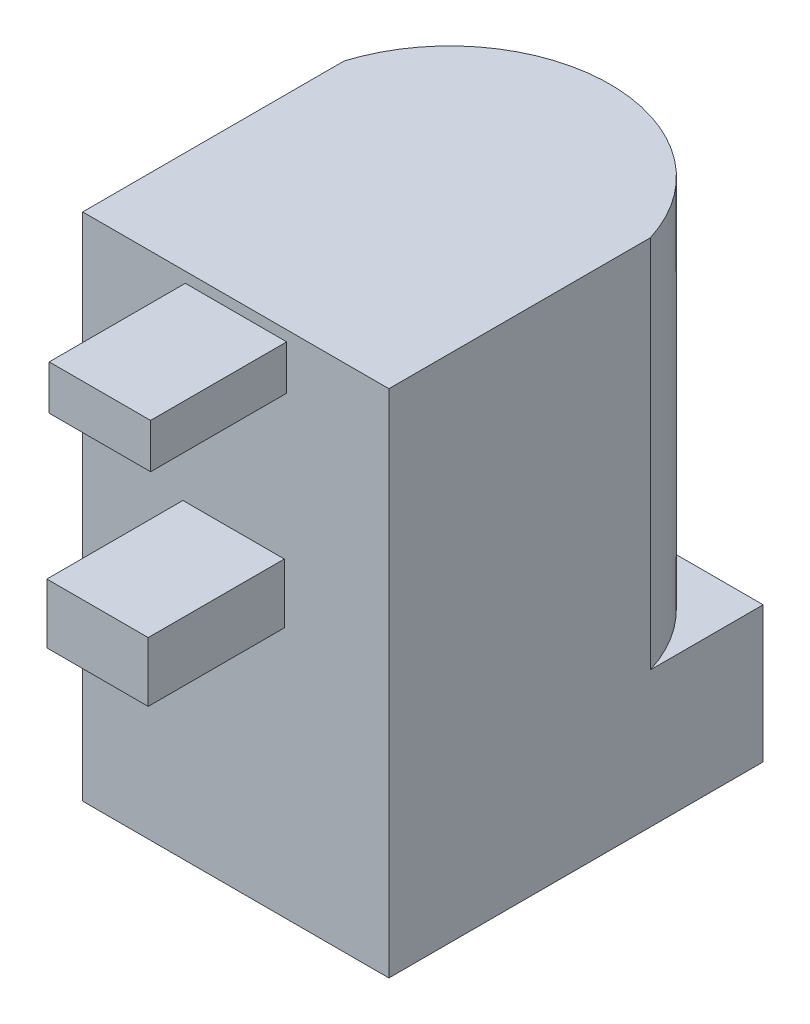
ISO-10303-21;
HEADER;
FILE_DESCRIPTION(('STEP AP214'),'2;1');
FILE_NAME('part.step','',(''),(''),'','','');
FILE_SCHEMA(('AUTOMOTIVE_DESIGN { 1 0 10303 214 1 1 1 1 }'));
ENDSEC;
DATA;
#1=APPLICATION_CONTEXT('core data for automotive mechanical design processes');
#2=APPLICATION_PROTOCOL_DEFINITION('international standard','automotive_design',2000,#1);
#3=PRODUCT_CONTEXT('',#1,'mechanical');
#4=PRODUCT('Part','Part','',(#3));
#5=PRODUCT_RELATED_PRODUCT_CATEGORY('part','',(#4));
#6=PRODUCT_DEFINITION_FORMATION('','',#4);
#7=PRODUCT_DEFINITION_CONTEXT('part definition',#1,'design');
#8=PRODUCT_DEFINITION('design','',#6,#7);
#9=PRODUCT_DEFINITION_SHAPE('','',#8);
#10=(LENGTH_UNIT() NAMED_UNIT(*) SI_UNIT(.MILLI.,.METRE.));
#11=(NAMED_UNIT(*) PLANE_ANGLE_UNIT() SI_UNIT($,.RADIAN.));
#12=(NAMED_UNIT(*) SI_UNIT($,.STERADIAN.) SOLID_ANGLE_UNIT());
#13=UNCERTAINTY_MEASURE_WITH_UNIT(LENGTH_MEASURE(1.E-05),#10,'distance_accuracy_value','');
#14=(GEOMETRIC_REPRESENTATION_CONTEXT(3) GLOBAL_UNCERTAINTY_ASSIGNED_CONTEXT((#13)) GLOBAL_UNIT_ASSIGNED_CONTEXT((#10,
#11,#12)) REPRESENTATION_CONTEXT('',''));
#15=CARTESIAN_POINT('',(0.,0.,0.));
#16=DIRECTION('',(0.,0.,1.));
#17=DIRECTION('',(1.,0.,0.));
#18=AXIS2_PLACEMENT_3D('',#15,#16,#17);
#19=CARTESIAN_POINT('',(-3.84818941504178,15.,5.33426183844011));
#20=DIRECTION('',(0.,0.,-1.));
#21=DIRECTION('',(-1.,0.,0.));
#22=AXIS2_PLACEMENT_3D('',#19,#20,#21);
#23=PLANE('',#22);
#24=DIRECTION('',(0.,-1.,0.));
#25=VECTOR('',#24,1.);
#26=CARTESIAN_POINT('',(-0.832403017018213,13.3838371317521,5.33426183844011));
#27=LINE('',#26,#25);
#28=CARTESIAN_POINT('',(-0.832403017018213,14.6905222156593,5.33426183844011));
#29=VERTEX_POINT('',#28);
#30=CARTESIAN_POINT('',(-0.832403017018213,13.3838371317521,5.33426183844011));
#31=VERTEX_POINT('',#30);
#32=EDGE_CURVE('E159',#29,#31,#27,.T.);
#33=ORIENTED_EDGE('',*,*,#32,.F.);
#34=DIRECTION('',(-1.,0.,0.));
#35=VECTOR('',#34,1.);
#36=CARTESIAN_POINT('',(-0.832403017018213,14.6905222156593,5.33426183844011));
#37=LINE('',#36,#35);
#38=CARTESIAN_POINT('',(2.14747638164835,14.6905222156593,5.33426183844011));
#39=VERTEX_POINT('',#38);
#40=EDGE_CURVE('E172',#39,#29,#37,.T.);
#41=ORIENTED_EDGE('',*,*,#40,.F.);
#42=DIRECTION('',(0.,1.,0.));
#43=VECTOR('',#42,1.);
#44=CARTESIAN_POINT('',(2.14747638164835,13.3838371317521,5.33426183844011));
#45=LINE('',#44,#43);
#46=CARTESIAN_POINT('',(2.14747638164835,13.3838371317521,5.33426183844011));
#47=VERTEX_POINT('',#46);
#48=EDGE_CURVE('E181',#47,#39,#45,.T.);
#49=ORIENTED_EDGE('',*,*,#48,.F.);
#50=DIRECTION('',(1.,0.,0.));
#51=VECTOR('',#50,1.);
#52=CARTESIAN_POINT('',(-0.832403017018213,13.3838371317521,5.33426183844011));
#53=LINE('',#52,#51);
#54=EDGE_CURVE('E162',#31,#47,#53,.T.);
#55=ORIENTED_EDGE('',*,*,#54,.F.);
#56=EDGE_LOOP('',(#33,#41,#49,#55));
#57=FACE_BOUND('',#56,.T.);
#58=DIRECTION('',(1.,0.,0.));
#59=VECTOR('',#58,1.);
#60=CARTESIAN_POINT('',(-3.84818941504178,0.,5.33426183844011));
#61=LINE('',#60,#59);
#62=CARTESIAN_POINT('',(-3.84818941504178,0.,5.33426183844011));
#63=VERTEX_POINT('',#62);
#64=CARTESIAN_POINT('',(5.15181058495822,0.,5.33426183844011));
#65=VERTEX_POINT('',#64);
#66=EDGE_CURVE('E231',#63,#65,#61,.T.);
#67=ORIENTED_EDGE('',*,*,#66,.T.);
#68=DIRECTION('',(0.,-1.,0.));
#69=VECTOR('',#68,1.);
#70=CARTESIAN_POINT('',(5.15181058495822,15.,5.33426183844011));
#71=LINE('',#70,#69);
#72=CARTESIAN_POINT('',(5.15181058495822,15.,5.33426183844011));
#73=VERTEX_POINT('',#72);
#74=EDGE_CURVE('E241',#73,#65,#71,.T.);
#75=ORIENTED_EDGE('',*,*,#74,.F.);
#76=DIRECTION('',(1.,0.,0.));
#77=VECTOR('',#76,1.);
#78=CARTESIAN_POINT('',(-3.84818941504178,15.,5.33426183844011));
#79=LINE('',#78,#77);
#80=CARTESIAN_POINT('',(-3.84818941504178,15.,5.33426183844011));
#81=VERTEX_POINT('',#80);
#82=EDGE_CURVE('E222',#81,#73,#79,.T.);
#83=ORIENTED_EDGE('',*,*,#82,.F.);
#84=DIRECTION('',(0.,-1.,0.));
#85=VECTOR('',#84,1.);
#86=CARTESIAN_POINT('',(-3.84818941504178,15.,5.33426183844011));
#87=LINE('',#86,#85);
#88=EDGE_CURVE('E244',#81,#63,#87,.T.);
#89=ORIENTED_EDGE('',*,*,#88,.T.);
#90=EDGE_LOOP('',(#67,#75,#83,#89));
#91=FACE_BOUND('',#90,.T.);
#92=DIRECTION('',(0.,-1.,0.));
#93=VECTOR('',#92,1.);
#94=CARTESIAN_POINT('',(-0.901871002237108,9.12840277679505,5.33426183844011));
#95=LINE('',#94,#93);
#96=CARTESIAN_POINT('',(-0.901871002237108,9.12840277679505,5.33426183844011));
#97=VERTEX_POINT('',#96);
#98=CARTESIAN_POINT('',(-0.901871002237108,7.37553254228531,5.33426183844011));
#99=VERTEX_POINT('',#98);
#100=EDGE_CURVE('E158',#97,#99,#95,.T.);
#101=ORIENTED_EDGE('',*,*,#100,.F.);
#102=DIRECTION('',(-1.,0.,0.));
#103=VECTOR('',#102,1.);
#104=CARTESIAN_POINT('',(-0.901871002237108,9.12840277679505,5.33426183844011));
#105=LINE('',#104,#103);
#106=CARTESIAN_POINT('',(2.07800839642946,9.12840277679505,5.33426183844011));
#107=VERTEX_POINT('',#106);
#108=EDGE_CURVE('E155',#107,#97,#105,.T.);
#109=ORIENTED_EDGE('',*,*,#108,.F.);
#110=DIRECTION('',(0.,1.,0.));
#111=VECTOR('',#110,1.);
#112=CARTESIAN_POINT('',(2.07800839642945,9.12840277679505,5.33426183844011));
#113=LINE('',#112,#111);
#114=CARTESIAN_POINT('',(2.07800839642945,7.37553254228531,5.33426183844011));
#115=VERTEX_POINT('',#114);
#116=EDGE_CURVE('E54',#115,#107,#113,.T.);
#117=ORIENTED_EDGE('',*,*,#116,.F.);
#118=DIRECTION('',(1.,0.,0.));
#119=VECTOR('',#118,1.);
#120=CARTESIAN_POINT('',(-0.901871002237108,7.37553254228531,5.33426183844011));
#121=LINE('',#120,#119);
#122=EDGE_CURVE('E49',#99,#115,#121,.T.);
#123=ORIENTED_EDGE('',*,*,#122,.F.);
#124=EDGE_LOOP('',(#101,#109,#117,#123));
#125=FACE_BOUND('',#124,.T.);
#126=ADVANCED_FACE('F34',(#57,#91,#125),#23,.F.);
#127=CARTESIAN_POINT('',(0.,15.,0.));
#128=DIRECTION('',(0.,1.,0.));
#129=DIRECTION('',(0.,0.,1.));
#130=AXIS2_PLACEMENT_3D('',#127,#128,#129);
#131=PLANE('',#130);
#132=CARTESIAN_POINT('',(0.651810584958218,15.,-0.953836315234177));
#133=DIRECTION('',(0.,1.,0.));
#134=DIRECTION('',(0.,0.,1.));
#135=AXIS2_PLACEMENT_3D('',#132,#133,#134);
#136=CIRCLE('',#135,4.71190184632571);
#137=CARTESIAN_POINT('',(-3.84818941504178,15.,-2.35098305391542));
#138=VERTEX_POINT('',#137);
#139=CARTESIAN_POINT('',(5.15181058495822,15.,-2.35098305391542));
#140=VERTEX_POINT('',#139);
#141=EDGE_CURVE('E246',#138,#140,#136,.F.);
#142=ORIENTED_EDGE('',*,*,#141,.F.);
#143=DIRECTION('',(0.,0.,1.));
#144=VECTOR('',#143,1.);
#145=CARTESIAN_POINT('',(-3.84818941504178,15.,-5.66573816155989));
#146=LINE('',#145,#144);
#147=EDGE_CURVE('E220',#138,#81,#146,.T.);
#148=ORIENTED_EDGE('',*,*,#147,.T.);
#149=ORIENTED_EDGE('',*,*,#82,.T.);
#150=DIRECTION('',(0.,0.,-1.));
#151=VECTOR('',#150,1.);
#152=CARTESIAN_POINT('',(5.15181058495822,15.,-5.66573816155989));
#153=LINE('',#152,#151);
#154=EDGE_CURVE('E225',#73,#140,#153,.T.);
#155=ORIENTED_EDGE('',*,*,#154,.T.);
#156=EDGE_LOOP('',(#142,#148,#149,#155));
#157=FACE_BOUND('',#156,.T.);
#158=ADVANCED_FACE('F284',(#157),#131,.T.);
#159=CARTESIAN_POINT('',(-3.84818941504178,15.,-5.66573816155989));
#160=DIRECTION('',(1.,0.,0.));
#161=DIRECTION('',(0.,0.,-1.));
#162=AXIS2_PLACEMENT_3D('',#159,#160,#161);
#163=PLANE('',#162);
#164=ORIENTED_EDGE('',*,*,#147,.F.);
#165=DIRECTION('',(0.,1.,0.));
#166=VECTOR('',#165,1.);
#167=CARTESIAN_POINT('',(-3.84818941504178,4.,-2.35098305391542));
#168=LINE('',#167,#166);
#169=CARTESIAN_POINT('',(-3.84818941504178,4.,-2.35098305391542));
#170=VERTEX_POINT('',#169);
#171=EDGE_CURVE('E208',#170,#138,#168,.T.);
#172=ORIENTED_EDGE('',*,*,#171,.F.);
#173=DIRECTION('',(0.,0.,-1.));
#174=VECTOR('',#173,1.);
#175=CARTESIAN_POINT('',(-3.84818941504178,4.,-5.66573816155989));
#176=LINE('',#175,#174);
#177=CARTESIAN_POINT('',(-3.84818941504178,4.,-5.66573816155989));
#178=VERTEX_POINT('',#177);
#179=EDGE_CURVE('E216',#170,#178,#176,.T.);
#180=ORIENTED_EDGE('',*,*,#179,.T.);
#181=DIRECTION('',(0.,-1.,0.));
#182=VECTOR('',#181,1.);
#183=CARTESIAN_POINT('',(-3.84818941504178,15.,-5.66573816155989));
#184=LINE('',#183,#182);
#185=CARTESIAN_POINT('',(-3.84818941504178,0.,-5.66573816155989));
#186=VERTEX_POINT('',#185);
#187=EDGE_CURVE('E228',#178,#186,#184,.T.);
#188=ORIENTED_EDGE('',*,*,#187,.T.);
#189=DIRECTION('',(0.,0.,1.));
#190=VECTOR('',#189,1.);
#191=CARTESIAN_POINT('',(-3.84818941504178,0.,-5.66573816155989));
#192=LINE('',#191,#190);
#193=EDGE_CURVE('E219',#186,#63,#192,.T.);
#194=ORIENTED_EDGE('',*,*,#193,.T.);
#195=ORIENTED_EDGE('',*,*,#88,.F.);
#196=EDGE_LOOP('',(#164,#172,#180,#188,#194,#195));
#197=FACE_BOUND('',#196,.T.);
#198=ADVANCED_FACE('F36',(#197),#163,.F.);
#199=CARTESIAN_POINT('',(5.15181058495822,15.,-5.66573816155989));
#200=DIRECTION('',(-1.,0.,0.));
#201=DIRECTION('',(0.,0.,1.));
#202=AXIS2_PLACEMENT_3D('',#199,#200,#201);
#203=PLANE('',#202);
#204=DIRECTION('',(0.,0.,1.));
#205=VECTOR('',#204,1.);
#206=CARTESIAN_POINT('',(5.15181058495822,4.,-5.66573816155989));
#207=LINE('',#206,#205);
#208=CARTESIAN_POINT('',(5.15181058495822,4.,-5.66573816155989));
#209=VERTEX_POINT('',#208);
#210=CARTESIAN_POINT('',(5.15181058495822,4.,-2.35098305391542));
#211=VERTEX_POINT('',#210);
#212=EDGE_CURVE('E211',#209,#211,#207,.T.);
#213=ORIENTED_EDGE('',*,*,#212,.T.);
#214=DIRECTION('',(0.,1.,0.));
#215=VECTOR('',#214,1.);
#216=CARTESIAN_POINT('',(5.15181058495822,4.,-2.35098305391542));
#217=LINE('',#216,#215);
#218=EDGE_CURVE('E207',#211,#140,#217,.T.);
#219=ORIENTED_EDGE('',*,*,#218,.T.);
#220=ORIENTED_EDGE('',*,*,#154,.F.);
#221=ORIENTED_EDGE('',*,*,#74,.T.);
#222=DIRECTION('',(0.,0.,-1.));
#223=VECTOR('',#222,1.);
#224=CARTESIAN_POINT('',(5.15181058495822,0.,-5.66573816155989));
#225=LINE('',#224,#223);
#226=CARTESIAN_POINT('',(5.15181058495822,0.,-5.66573816155989));
#227=VERTEX_POINT('',#226);
#228=EDGE_CURVE('E233',#65,#227,#225,.T.);
#229=ORIENTED_EDGE('',*,*,#228,.T.);
#230=DIRECTION('',(0.,-1.,0.));
#231=VECTOR('',#230,1.);
#232=CARTESIAN_POINT('',(5.15181058495822,15.,-5.66573816155989));
#233=LINE('',#232,#231);
#234=EDGE_CURVE('E239',#209,#227,#233,.T.);
#235=ORIENTED_EDGE('',*,*,#234,.F.);
#236=EDGE_LOOP('',(#213,#219,#220,#221,#229,#235));
#237=FACE_BOUND('',#236,.T.);
#238=ADVANCED_FACE('F257',(#237),#203,.F.);
#239=CARTESIAN_POINT('',(-3.84818941504178,15.,-5.66573816155989));
#240=DIRECTION('',(0.,0.,1.));
#241=DIRECTION('',(1.,0.,0.));
#242=AXIS2_PLACEMENT_3D('',#239,#240,#241);
#243=PLANE('',#242);
#244=ORIENTED_EDGE('',*,*,#187,.F.);
#245=DIRECTION('',(1.,0.,0.));
#246=VECTOR('',#245,1.);
#247=CARTESIAN_POINT('',(-3.84818941504178,4.,-5.66573816155989));
#248=LINE('',#247,#246);
#249=CARTESIAN_POINT('',(0.651810584958218,4.,-5.66573816155989));
#250=VERTEX_POINT('',#249);
#251=EDGE_CURVE('E11',#178,#250,#248,.T.);
#252=ORIENTED_EDGE('',*,*,#251,.T.);
#253=EDGE_CURVE('E38',#250,#209,#248,.T.);
#254=ORIENTED_EDGE('',*,*,#253,.T.);
#255=ORIENTED_EDGE('',*,*,#234,.T.);
#256=DIRECTION('',(-1.,0.,0.));
#257=VECTOR('',#256,1.);
#258=CARTESIAN_POINT('',(-3.84818941504178,0.,-5.66573816155989));
#259=LINE('',#258,#257);
#260=EDGE_CURVE('E223',#227,#186,#259,.T.);
#261=ORIENTED_EDGE('',*,*,#260,.T.);
#262=EDGE_LOOP('',(#244,#252,#254,#255,#261));
#263=FACE_BOUND('',#262,.T.);
#264=ADVANCED_FACE('F253',(#263),#243,.F.);
#265=CARTESIAN_POINT('',(0.,0.,0.));
#266=DIRECTION('',(0.,1.,0.));
#267=DIRECTION('',(0.,0.,1.));
#268=AXIS2_PLACEMENT_3D('',#265,#266,#267);
#269=PLANE('',#268);
#270=CARTESIAN_POINT('',(0.651810584958219,0.,-0.165738161559888));
#271=DIRECTION('',(0.,-1.,0.));
#272=DIRECTION('',(0.,0.,-1.));
#273=AXIS2_PLACEMENT_3D('',#270,#271,#272);
#274=CIRCLE('',#273,3.15);
#275=CARTESIAN_POINT('',(0.651810584958219,0.,-3.31573816155989));
#276=VERTEX_POINT('',#275);
#277=EDGE_CURVE('E197',#276,#276,#274,.T.);
#278=ORIENTED_EDGE('',*,*,#277,.F.);
#279=EDGE_LOOP('',(#278));
#280=FACE_BOUND('',#279,.T.);
#281=ORIENTED_EDGE('',*,*,#193,.F.);
#282=ORIENTED_EDGE('',*,*,#260,.F.);
#283=ORIENTED_EDGE('',*,*,#228,.F.);
#284=ORIENTED_EDGE('',*,*,#66,.F.);
#285=EDGE_LOOP('',(#281,#282,#283,#284));
#286=FACE_BOUND('',#285,.T.);
#287=ADVANCED_FACE('F264',(#280,#286),#269,.F.);
#288=CARTESIAN_POINT('',(0.651810584958218,4.,-0.953836315234177));
#289=DIRECTION('',(0.,-1.,0.));
#290=DIRECTION('',(0.,0.,-1.));
#291=AXIS2_PLACEMENT_3D('',#288,#289,#290);
#292=PLANE('',#291);
#293=CARTESIAN_POINT('',(0.651810584958218,4.,-0.953836315234177));
#294=DIRECTION('',(0.,-1.,0.));
#295=DIRECTION('',(0.,0.,-1.));
#296=AXIS2_PLACEMENT_3D('',#293,#294,#295);
#297=CIRCLE('',#296,4.71190184632571);
#298=EDGE_CURVE('E204',#170,#250,#297,.T.);
#299=ORIENTED_EDGE('',*,*,#298,.T.);
#300=ORIENTED_EDGE('',*,*,#251,.F.);
#301=ORIENTED_EDGE('',*,*,#179,.F.);
#302=EDGE_LOOP('',(#299,#300,#301));
#303=FACE_BOUND('',#302,.T.);
#304=ADVANCED_FACE('F271',(#303),#292,.F.);
#305=ORIENTED_EDGE('',*,*,#253,.F.);
#306=EDGE_CURVE('E201',#250,#211,#297,.T.);
#307=ORIENTED_EDGE('',*,*,#306,.T.);
#308=ORIENTED_EDGE('',*,*,#212,.F.);
#309=EDGE_LOOP('',(#305,#307,#308));
#310=FACE_BOUND('',#309,.T.);
#311=ADVANCED_FACE('F273',(#310),#292,.F.);
#312=CARTESIAN_POINT('',(0.651810584958218,4.,-0.953836315234177));
#313=DIRECTION('',(0.,1.,0.));
#314=DIRECTION('',(0.,0.,1.));
#315=AXIS2_PLACEMENT_3D('',#312,#313,#314);
#316=CYLINDRICAL_SURFACE('',#315,4.71190184632571);
#317=ORIENTED_EDGE('',*,*,#141,.T.);
#318=ORIENTED_EDGE('',*,*,#218,.F.);
#319=ORIENTED_EDGE('',*,*,#306,.F.);
#320=ORIENTED_EDGE('',*,*,#298,.F.);
#321=ORIENTED_EDGE('',*,*,#171,.T.);
#322=EDGE_LOOP('',(#317,#318,#319,#320,#321));
#323=FACE_BOUND('',#322,.T.);
#324=ADVANCED_FACE('F272',(#323),#316,.T.);
#325=CARTESIAN_POINT('',(0.651810584958219,11.,-0.165738161559888));
#326=DIRECTION('',(0.,-1.,0.));
#327=DIRECTION('',(0.,0.,-1.));
#328=AXIS2_PLACEMENT_3D('',#325,#326,#327);
#329=CYLINDRICAL_SURFACE('',#328,3.15);
#330=CARTESIAN_POINT('',(0.651810584958219,11.,-0.165738161559888));
#331=DIRECTION('',(0.,-1.,0.));
#332=DIRECTION('',(0.,0.,-1.));
#333=AXIS2_PLACEMENT_3D('',#330,#331,#332);
#334=CIRCLE('',#333,3.15);
#335=CARTESIAN_POINT('',(0.651810584958219,11.,-3.31573816155989));
#336=VERTEX_POINT('',#335);
#337=EDGE_CURVE('E198',#336,#336,#334,.T.);
#338=ORIENTED_EDGE('',*,*,#337,.F.);
#339=EDGE_LOOP('',(#338));
#340=FACE_BOUND('',#339,.T.);
#341=ORIENTED_EDGE('',*,*,#277,.T.);
#342=EDGE_LOOP('',(#341));
#343=FACE_BOUND('',#342,.T.);
#344=ADVANCED_FACE('F280',(#340,#343),#329,.F.);
#345=CARTESIAN_POINT('',(0.651810584958219,11.,-0.165738161559888));
#346=DIRECTION('',(0.,-1.,0.));
#347=DIRECTION('',(0.,0.,-1.));
#348=AXIS2_PLACEMENT_3D('',#345,#346,#347);
#349=PLANE('',#348);
#350=ORIENTED_EDGE('',*,*,#337,.T.);
#351=EDGE_LOOP('',(#350));
#352=FACE_BOUND('',#351,.T.);
#353=ADVANCED_FACE('F304',(#352),#349,.T.);
#354=CARTESIAN_POINT('',(-0.832403017018213,13.3838371317521,9.33426183844011));
#355=DIRECTION('',(1.,0.,0.));
#356=DIRECTION('',(0.,0.,-1.));
#357=AXIS2_PLACEMENT_3D('',#354,#355,#356);
#358=PLANE('',#357);
#359=ORIENTED_EDGE('',*,*,#32,.T.);
#360=DIRECTION('',(0.,0.,-1.));
#361=VECTOR('',#360,1.);
#362=CARTESIAN_POINT('',(-0.832403017018213,13.3838371317521,9.33426183844011));
#363=LINE('',#362,#361);
#364=CARTESIAN_POINT('',(-0.832403017018213,13.3838371317521,9.33426183844011));
#365=VERTEX_POINT('',#364);
#366=EDGE_CURVE('E194',#365,#31,#363,.T.);
#367=ORIENTED_EDGE('',*,*,#366,.F.);
#368=DIRECTION('',(0.,-1.,0.));
#369=VECTOR('',#368,1.);
#370=CARTESIAN_POINT('',(-0.832403017018213,13.3838371317521,9.33426183844011));
#371=LINE('',#370,#369);
#372=CARTESIAN_POINT('',(-0.832403017018213,14.6905222156593,9.33426183844011));
#373=VERTEX_POINT('',#372);
#374=EDGE_CURVE('E168',#373,#365,#371,.T.);
#375=ORIENTED_EDGE('',*,*,#374,.F.);
#376=DIRECTION('',(0.,0.,-1.));
#377=VECTOR('',#376,1.);
#378=CARTESIAN_POINT('',(-0.832403017018213,14.6905222156593,9.33426183844011));
#379=LINE('',#378,#377);
#380=EDGE_CURVE('E177',#373,#29,#379,.T.);
#381=ORIENTED_EDGE('',*,*,#380,.T.);
#382=EDGE_LOOP('',(#359,#367,#375,#381));
#383=FACE_BOUND('',#382,.T.);
#384=ADVANCED_FACE('F309',(#383),#358,.F.);
#385=CARTESIAN_POINT('',(-0.832403017018213,13.3838371317521,9.33426183844011));
#386=DIRECTION('',(0.,1.,0.));
#387=DIRECTION('',(0.,0.,1.));
#388=AXIS2_PLACEMENT_3D('',#385,#386,#387);
#389=PLANE('',#388);
#390=ORIENTED_EDGE('',*,*,#54,.T.);
#391=DIRECTION('',(0.,0.,-1.));
#392=VECTOR('',#391,1.);
#393=CARTESIAN_POINT('',(2.14747638164835,13.3838371317521,9.33426183844011));
#394=LINE('',#393,#392);
#395=CARTESIAN_POINT('',(2.14747638164835,13.3838371317521,9.33426183844011));
#396=VERTEX_POINT('',#395);
#397=EDGE_CURVE('E191',#396,#47,#394,.T.);
#398=ORIENTED_EDGE('',*,*,#397,.F.);
#399=DIRECTION('',(1.,0.,0.));
#400=VECTOR('',#399,1.);
#401=CARTESIAN_POINT('',(-0.832403017018213,13.3838371317521,9.33426183844011));
#402=LINE('',#401,#400);
#403=EDGE_CURVE('E171',#365,#396,#402,.T.);
#404=ORIENTED_EDGE('',*,*,#403,.F.);
#405=ORIENTED_EDGE('',*,*,#366,.T.);
#406=EDGE_LOOP('',(#390,#398,#404,#405));
#407=FACE_BOUND('',#406,.T.);
#408=ADVANCED_FACE('F316',(#407),#389,.F.);
#409=CARTESIAN_POINT('',(2.14747638164835,13.3838371317521,9.33426183844011));
#410=DIRECTION('',(-1.,0.,0.));
#411=DIRECTION('',(0.,0.,1.));
#412=AXIS2_PLACEMENT_3D('',#409,#410,#411);
#413=PLANE('',#412);
#414=ORIENTED_EDGE('',*,*,#48,.T.);
#415=DIRECTION('',(0.,0.,-1.));
#416=VECTOR('',#415,1.);
#417=CARTESIAN_POINT('',(2.14747638164835,14.6905222156593,9.33426183844011));
#418=LINE('',#417,#416);
#419=CARTESIAN_POINT('',(2.14747638164835,14.6905222156593,9.33426183844011));
#420=VERTEX_POINT('',#419);
#421=EDGE_CURVE('E188',#420,#39,#418,.T.);
#422=ORIENTED_EDGE('',*,*,#421,.F.);
#423=DIRECTION('',(0.,1.,0.));
#424=VECTOR('',#423,1.);
#425=CARTESIAN_POINT('',(2.14747638164835,13.3838371317521,9.33426183844011));
#426=LINE('',#425,#424);
#427=EDGE_CURVE('E174',#396,#420,#426,.T.);
#428=ORIENTED_EDGE('',*,*,#427,.F.);
#429=ORIENTED_EDGE('',*,*,#397,.T.);
#430=EDGE_LOOP('',(#414,#422,#428,#429));
#431=FACE_BOUND('',#430,.T.);
#432=ADVANCED_FACE('F320',(#431),#413,.F.);
#433=CARTESIAN_POINT('',(-0.832403017018213,14.6905222156593,9.33426183844011));
#434=DIRECTION('',(0.,-1.,0.));
#435=DIRECTION('',(0.,0.,-1.));
#436=AXIS2_PLACEMENT_3D('',#433,#434,#435);
#437=PLANE('',#436);
#438=ORIENTED_EDGE('',*,*,#40,.T.);
#439=ORIENTED_EDGE('',*,*,#380,.F.);
#440=DIRECTION('',(-1.,0.,0.));
#441=VECTOR('',#440,1.);
#442=CARTESIAN_POINT('',(-0.832403017018213,14.6905222156593,9.33426183844011));
#443=LINE('',#442,#441);
#444=EDGE_CURVE('E176',#420,#373,#443,.T.);
#445=ORIENTED_EDGE('',*,*,#444,.F.);
#446=ORIENTED_EDGE('',*,*,#421,.T.);
#447=EDGE_LOOP('',(#438,#439,#445,#446));
#448=FACE_BOUND('',#447,.T.);
#449=ADVANCED_FACE('F324',(#448),#437,.F.);
#450=CARTESIAN_POINT('',(0.,0.,9.33426183844011));
#451=DIRECTION('',(0.,0.,-1.));
#452=DIRECTION('',(-1.,0.,0.));
#453=AXIS2_PLACEMENT_3D('',#450,#451,#452);
#454=PLANE('',#453);
#455=ORIENTED_EDGE('',*,*,#374,.T.);
#456=ORIENTED_EDGE('',*,*,#403,.T.);
#457=ORIENTED_EDGE('',*,*,#427,.T.);
#458=ORIENTED_EDGE('',*,*,#444,.T.);
#459=EDGE_LOOP('',(#455,#456,#457,#458));
#460=FACE_BOUND('',#459,.T.);
#461=ADVANCED_FACE('F328',(#460),#454,.F.);
#462=CARTESIAN_POINT('',(-0.901871002237108,9.12840277679505,9.33426183844011));
#463=DIRECTION('',(1.,0.,0.));
#464=DIRECTION('',(0.,1.,0.));
#465=AXIS2_PLACEMENT_3D('',#462,#463,#464);
#466=PLANE('',#465);
#467=ORIENTED_EDGE('',*,*,#100,.T.);
#468=DIRECTION('',(0.,0.,-1.));
#469=VECTOR('',#468,1.);
#470=CARTESIAN_POINT('',(-0.901871002237108,7.37553254228531,9.33426183844011));
#471=LINE('',#470,#469);
#472=CARTESIAN_POINT('',(-0.901871002237108,7.37553254228531,9.33426183844011));
#473=VERTEX_POINT('',#472);
#474=EDGE_CURVE('E139',#473,#99,#471,.T.);
#475=ORIENTED_EDGE('',*,*,#474,.F.);
#476=DIRECTION('',(0.,-1.,0.));
#477=VECTOR('',#476,1.);
#478=CARTESIAN_POINT('',(-0.901871002237108,9.12840277679505,9.33426183844011));
#479=LINE('',#478,#477);
#480=CARTESIAN_POINT('',(-0.901871002237108,9.12840277679505,9.33426183844011));
#481=VERTEX_POINT('',#480);
#482=EDGE_CURVE('E146',#481,#473,#479,.T.);
#483=ORIENTED_EDGE('',*,*,#482,.F.);
#484=DIRECTION('',(0.,0.,-1.));
#485=VECTOR('',#484,1.);
#486=CARTESIAN_POINT('',(-0.901871002237108,9.12840277679505,9.33426183844011));
#487=LINE('',#486,#485);
#488=EDGE_CURVE('E467',#481,#97,#487,.T.);
#489=ORIENTED_EDGE('',*,*,#488,.T.);
#490=EDGE_LOOP('',(#467,#475,#483,#489));
#491=FACE_BOUND('',#490,.T.);
#492=ADVANCED_FACE('F157',(#491),#466,.F.);
#493=CARTESIAN_POINT('',(-0.901871002237108,7.37553254228531,9.33426183844011));
#494=DIRECTION('',(0.,1.,0.));
#495=DIRECTION('',(0.,0.,1.));
#496=AXIS2_PLACEMENT_3D('',#493,#494,#495);
#497=PLANE('',#496);
#498=ORIENTED_EDGE('',*,*,#122,.T.);
#499=DIRECTION('',(0.,0.,-1.));
#500=VECTOR('',#499,1.);
#501=CARTESIAN_POINT('',(2.07800839642945,7.37553254228531,9.33426183844011));
#502=LINE('',#501,#500);
#503=CARTESIAN_POINT('',(2.07800839642945,7.37553254228531,9.33426183844011));
#504=VERTEX_POINT('',#503);
#505=EDGE_CURVE('E142',#504,#115,#502,.T.);
#506=ORIENTED_EDGE('',*,*,#505,.F.);
#507=DIRECTION('',(1.,0.,0.));
#508=VECTOR('',#507,1.);
#509=CARTESIAN_POINT('',(-0.901871002237108,7.37553254228531,9.33426183844011));
#510=LINE('',#509,#508);
#511=EDGE_CURVE('E135',#473,#504,#510,.T.);
#512=ORIENTED_EDGE('',*,*,#511,.F.);
#513=ORIENTED_EDGE('',*,*,#474,.T.);
#514=EDGE_LOOP('',(#498,#506,#512,#513));
#515=FACE_BOUND('',#514,.T.);
#516=ADVANCED_FACE('F137',(#515),#497,.F.);
#517=CARTESIAN_POINT('',(2.07800839642945,9.12840277679505,9.33426183844011));
#518=DIRECTION('',(-1.,0.,0.));
#519=DIRECTION('',(0.,0.,1.));
#520=AXIS2_PLACEMENT_3D('',#517,#518,#519);
#521=PLANE('',#520);
#522=ORIENTED_EDGE('',*,*,#116,.T.);
#523=DIRECTION('',(0.,0.,-1.));
#524=VECTOR('',#523,1.);
#525=CARTESIAN_POINT('',(2.07800839642945,9.12840277679505,9.33426183844011));
#526=LINE('',#525,#524);
#527=CARTESIAN_POINT('',(2.07800839642945,9.12840277679505,9.33426183844011));
#528=VERTEX_POINT('',#527);
#529=EDGE_CURVE('E164',#528,#107,#526,.T.);
#530=ORIENTED_EDGE('',*,*,#529,.F.);
#531=DIRECTION('',(0.,1.,0.));
#532=VECTOR('',#531,1.);
#533=CARTESIAN_POINT('',(2.07800839642945,9.12840277679505,9.33426183844011));
#534=LINE('',#533,#532);
#535=EDGE_CURVE('E145',#504,#528,#534,.T.);
#536=ORIENTED_EDGE('',*,*,#535,.F.);
#537=ORIENTED_EDGE('',*,*,#505,.T.);
#538=EDGE_LOOP('',(#522,#530,#536,#537));
#539=FACE_BOUND('',#538,.T.);
#540=ADVANCED_FACE('F337',(#539),#521,.F.);
#541=CARTESIAN_POINT('',(-0.901871002237108,9.12840277679505,9.33426183844011));
#542=DIRECTION('',(0.,-1.,0.));
#543=DIRECTION('',(0.,0.,-1.));
#544=AXIS2_PLACEMENT_3D('',#541,#542,#543);
#545=PLANE('',#544);
#546=ORIENTED_EDGE('',*,*,#108,.T.);
#547=ORIENTED_EDGE('',*,*,#488,.F.);
#548=DIRECTION('',(-1.,0.,0.));
#549=VECTOR('',#548,1.);
#550=CARTESIAN_POINT('',(-0.901871002237108,9.12840277679505,9.33426183844011));
#551=LINE('',#550,#549);
#552=EDGE_CURVE('E151',#528,#481,#551,.T.);
#553=ORIENTED_EDGE('',*,*,#552,.F.);
#554=ORIENTED_EDGE('',*,*,#529,.T.);
#555=EDGE_LOOP('',(#546,#547,#553,#554));
#556=FACE_BOUND('',#555,.T.);
#557=ADVANCED_FACE('F340',(#556),#545,.F.);
#558=CARTESIAN_POINT('',(0.,0.,9.33426183844011));
#559=DIRECTION('',(0.,0.,1.));
#560=DIRECTION('',(1.,0.,0.));
#561=AXIS2_PLACEMENT_3D('',#558,#559,#560);
#562=PLANE('',#561);
#563=ORIENTED_EDGE('',*,*,#482,.T.);
#564=ORIENTED_EDGE('',*,*,#511,.T.);
#565=ORIENTED_EDGE('',*,*,#535,.T.);
#566=ORIENTED_EDGE('',*,*,#552,.T.);
#567=EDGE_LOOP('',(#563,#564,#565,#566));
#568=FACE_BOUND('',#567,.T.);
#569=ADVANCED_FACE('F149',(#568),#562,.T.);
#570=CLOSED_SHELL('',(#126,#158,#198,#238,#264,#287,#304,#311,#324,#344,#353,#384,#408,#432,
#449,#461,#492,#516,#540,#557,#569));
#571=MANIFOLD_SOLID_BREP('B2',#570);
#572=ADVANCED_BREP_SHAPE_REPRESENTATION('',(#18,#571),#14);
#573=SHAPE_DEFINITION_REPRESENTATION(#9,#572);
ENDSEC;
END-ISO-10303-21;
